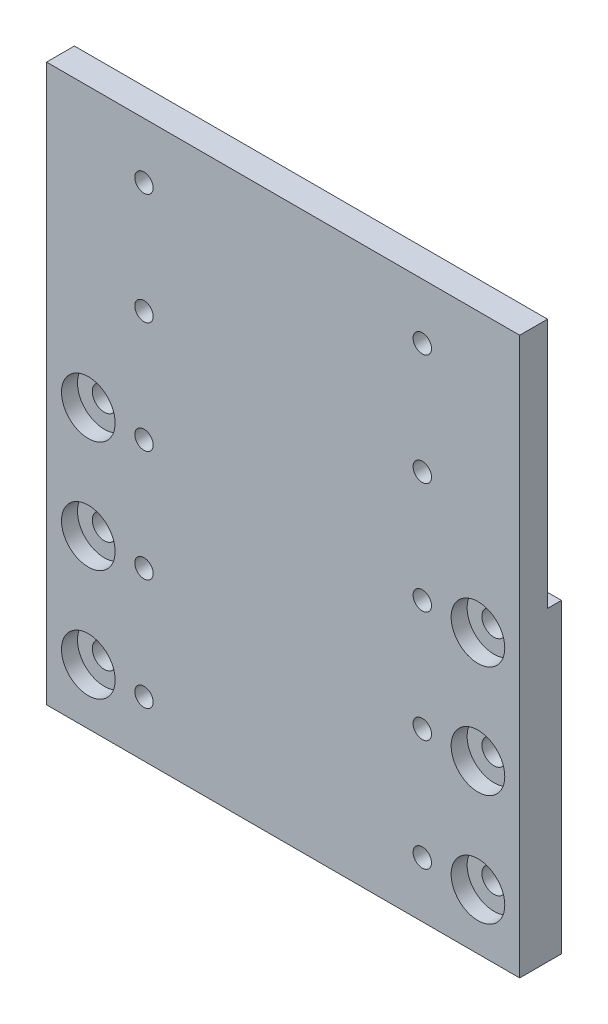
ISO-10303-21;
HEADER;
FILE_DESCRIPTION(('STEP AP214'),'2;1');
FILE_NAME('part.step','',(''),(''),'','','');
FILE_SCHEMA(('AUTOMOTIVE_DESIGN { 1 0 10303 214 1 1 1 1 }'));
ENDSEC;
DATA;
#1=APPLICATION_CONTEXT('core data for automotive mechanical design processes');
#2=APPLICATION_PROTOCOL_DEFINITION('international standard','automotive_design',2000,#1);
#3=PRODUCT_CONTEXT('',#1,'mechanical');
#4=PRODUCT('Part','Part','',(#3));
#5=PRODUCT_RELATED_PRODUCT_CATEGORY('part','',(#4));
#6=PRODUCT_DEFINITION_FORMATION('','',#4);
#7=PRODUCT_DEFINITION_CONTEXT('part definition',#1,'design');
#8=PRODUCT_DEFINITION('design','',#6,#7);
#9=PRODUCT_DEFINITION_SHAPE('','',#8);
#10=(LENGTH_UNIT() NAMED_UNIT(*) SI_UNIT(.MILLI.,.METRE.));
#11=(NAMED_UNIT(*) PLANE_ANGLE_UNIT() SI_UNIT($,.RADIAN.));
#12=(NAMED_UNIT(*) SI_UNIT($,.STERADIAN.) SOLID_ANGLE_UNIT());
#13=UNCERTAINTY_MEASURE_WITH_UNIT(LENGTH_MEASURE(1.E-05),#10,'distance_accuracy_value','');
#14=(GEOMETRIC_REPRESENTATION_CONTEXT(3) GLOBAL_UNCERTAINTY_ASSIGNED_CONTEXT((#13)) GLOBAL_UNIT_ASSIGNED_CONTEXT((#10,
#11,#12)) REPRESENTATION_CONTEXT('',''));
#15=CARTESIAN_POINT('',(0.,0.,0.));
#16=DIRECTION('',(0.,0.,1.));
#17=DIRECTION('',(1.,0.,0.));
#18=AXIS2_PLACEMENT_3D('',#15,#16,#17);
#19=CARTESIAN_POINT('',(53.975,63.5,9.525));
#20=DIRECTION('',(0.,-1.,0.));
#21=DIRECTION('',(0.,0.,-1.));
#22=AXIS2_PLACEMENT_3D('',#19,#20,#21);
#23=PLANE('',#22);
#24=DIRECTION('',(1.,0.,0.));
#25=VECTOR('',#24,1.);
#26=CARTESIAN_POINT('',(53.975,63.5,3.175));
#27=LINE('',#26,#25);
#28=CARTESIAN_POINT('',(-53.975,63.5,3.175));
#29=VERTEX_POINT('',#28);
#30=CARTESIAN_POINT('',(53.975,63.5,3.175));
#31=VERTEX_POINT('',#30);
#32=EDGE_CURVE('E104',#29,#31,#27,.T.);
#33=ORIENTED_EDGE('',*,*,#32,.F.);
#34=DIRECTION('',(0.,0.,-1.));
#35=VECTOR('',#34,1.);
#36=CARTESIAN_POINT('',(-53.975,63.5,9.525));
#37=LINE('',#36,#35);
#38=CARTESIAN_POINT('',(-53.975,63.5,9.525));
#39=VERTEX_POINT('',#38);
#40=EDGE_CURVE('E255',#39,#29,#37,.T.);
#41=ORIENTED_EDGE('',*,*,#40,.F.);
#42=DIRECTION('',(-1.,0.,0.));
#43=VECTOR('',#42,1.);
#44=CARTESIAN_POINT('',(53.975,63.5,9.525));
#45=LINE('',#44,#43);
#46=CARTESIAN_POINT('',(53.975,63.5,9.525));
#47=VERTEX_POINT('',#46);
#48=EDGE_CURVE('E56',#47,#39,#45,.T.);
#49=ORIENTED_EDGE('',*,*,#48,.F.);
#50=DIRECTION('',(0.,0.,-1.));
#51=VECTOR('',#50,1.);
#52=CARTESIAN_POINT('',(53.975,63.5,9.525));
#53=LINE('',#52,#51);
#54=EDGE_CURVE('E261',#47,#31,#53,.T.);
#55=ORIENTED_EDGE('',*,*,#54,.T.);
#56=EDGE_LOOP('',(#33,#41,#49,#55));
#57=FACE_BOUND('',#56,.T.);
#58=ADVANCED_FACE('F31',(#57),#23,.F.);
#59=CARTESIAN_POINT('',(-31.75,25.4,9.525));
#60=DIRECTION('',(0.,0.,1.));
#61=DIRECTION('',(1.,0.,0.));
#62=AXIS2_PLACEMENT_3D('',#59,#60,#61);
#63=CYLINDRICAL_SURFACE('',#62,2.1);
#64=CARTESIAN_POINT('',(-31.75,25.4,9.525));
#65=DIRECTION('',(0.,0.,1.));
#66=DIRECTION('',(1.,0.,0.));
#67=AXIS2_PLACEMENT_3D('',#64,#65,#66);
#68=CIRCLE('',#67,2.1);
#69=CARTESIAN_POINT('',(-29.65,25.4,9.525));
#70=VERTEX_POINT('',#69);
#71=EDGE_CURVE('E155',#70,#70,#68,.T.);
#72=ORIENTED_EDGE('',*,*,#71,.T.);
#73=EDGE_LOOP('',(#72));
#74=FACE_BOUND('',#73,.T.);
#75=CARTESIAN_POINT('',(-31.75,25.4,3.175));
#76=DIRECTION('',(0.,0.,-1.));
#77=DIRECTION('',(-1.,0.,0.));
#78=AXIS2_PLACEMENT_3D('',#75,#76,#77);
#79=CIRCLE('',#78,2.1);
#80=CARTESIAN_POINT('',(-33.85,25.4,3.175));
#81=VERTEX_POINT('',#80);
#82=EDGE_CURVE('E125',#81,#81,#79,.F.);
#83=ORIENTED_EDGE('',*,*,#82,.F.);
#84=EDGE_LOOP('',(#83));
#85=FACE_BOUND('',#84,.T.);
#86=ADVANCED_FACE('F291',(#74,#85),#63,.F.);
#87=CARTESIAN_POINT('',(-31.75,50.8,9.525));
#88=DIRECTION('',(0.,0.,1.));
#89=DIRECTION('',(1.,0.,0.));
#90=AXIS2_PLACEMENT_3D('',#87,#88,#89);
#91=CYLINDRICAL_SURFACE('',#90,2.1);
#92=CARTESIAN_POINT('',(-31.75,50.8,9.525));
#93=DIRECTION('',(0.,0.,1.));
#94=DIRECTION('',(1.,0.,0.));
#95=AXIS2_PLACEMENT_3D('',#92,#93,#94);
#96=CIRCLE('',#95,2.1);
#97=CARTESIAN_POINT('',(-29.65,50.8,9.525));
#98=VERTEX_POINT('',#97);
#99=EDGE_CURVE('E152',#98,#98,#96,.T.);
#100=ORIENTED_EDGE('',*,*,#99,.T.);
#101=EDGE_LOOP('',(#100));
#102=FACE_BOUND('',#101,.T.);
#103=CARTESIAN_POINT('',(-31.75,50.8,3.175));
#104=DIRECTION('',(0.,0.,-1.));
#105=DIRECTION('',(-1.,0.,0.));
#106=AXIS2_PLACEMENT_3D('',#103,#104,#105);
#107=CIRCLE('',#106,2.1);
#108=CARTESIAN_POINT('',(-33.85,50.8,3.175));
#109=VERTEX_POINT('',#108);
#110=EDGE_CURVE('E122',#109,#109,#107,.F.);
#111=ORIENTED_EDGE('',*,*,#110,.F.);
#112=EDGE_LOOP('',(#111));
#113=FACE_BOUND('',#112,.T.);
#114=ADVANCED_FACE('F297',(#102,#113),#91,.F.);
#115=CARTESIAN_POINT('',(31.75,25.4,9.525));
#116=DIRECTION('',(0.,0.,1.));
#117=DIRECTION('',(1.,0.,0.));
#118=AXIS2_PLACEMENT_3D('',#115,#116,#117);
#119=CYLINDRICAL_SURFACE('',#118,2.1);
#120=CARTESIAN_POINT('',(31.75,25.4,9.525));
#121=DIRECTION('',(0.,0.,1.));
#122=DIRECTION('',(1.,0.,0.));
#123=AXIS2_PLACEMENT_3D('',#120,#121,#122);
#124=CIRCLE('',#123,2.1);
#125=CARTESIAN_POINT('',(33.85,25.4,9.525));
#126=VERTEX_POINT('',#125);
#127=EDGE_CURVE('E131',#126,#126,#124,.T.);
#128=ORIENTED_EDGE('',*,*,#127,.T.);
#129=EDGE_LOOP('',(#128));
#130=FACE_BOUND('',#129,.T.);
#131=CARTESIAN_POINT('',(31.75,25.4,3.175));
#132=DIRECTION('',(0.,0.,-1.));
#133=DIRECTION('',(-1.,0.,0.));
#134=AXIS2_PLACEMENT_3D('',#131,#132,#133);
#135=CIRCLE('',#134,2.1);
#136=CARTESIAN_POINT('',(29.65,25.4,3.175));
#137=VERTEX_POINT('',#136);
#138=EDGE_CURVE('E119',#137,#137,#135,.F.);
#139=ORIENTED_EDGE('',*,*,#138,.F.);
#140=EDGE_LOOP('',(#139));
#141=FACE_BOUND('',#140,.T.);
#142=ADVANCED_FACE('F309',(#130,#141),#119,.F.);
#143=CARTESIAN_POINT('',(31.75,50.8,9.525));
#144=DIRECTION('',(0.,0.,1.));
#145=DIRECTION('',(1.,0.,0.));
#146=AXIS2_PLACEMENT_3D('',#143,#144,#145);
#147=CYLINDRICAL_SURFACE('',#146,2.1);
#148=CARTESIAN_POINT('',(31.75,50.8,9.525));
#149=DIRECTION('',(0.,0.,1.));
#150=DIRECTION('',(1.,0.,0.));
#151=AXIS2_PLACEMENT_3D('',#148,#149,#150);
#152=CIRCLE('',#151,2.1);
#153=CARTESIAN_POINT('',(33.85,50.8,9.525));
#154=VERTEX_POINT('',#153);
#155=EDGE_CURVE('E128',#154,#154,#152,.T.);
#156=ORIENTED_EDGE('',*,*,#155,.T.);
#157=EDGE_LOOP('',(#156));
#158=FACE_BOUND('',#157,.T.);
#159=CARTESIAN_POINT('',(31.75,50.8,3.175));
#160=DIRECTION('',(0.,0.,-1.));
#161=DIRECTION('',(-1.,0.,0.));
#162=AXIS2_PLACEMENT_3D('',#159,#160,#161);
#163=CIRCLE('',#162,2.1);
#164=CARTESIAN_POINT('',(29.65,50.8,3.175));
#165=VERTEX_POINT('',#164);
#166=EDGE_CURVE('E35',#165,#165,#163,.F.);
#167=ORIENTED_EDGE('',*,*,#166,.F.);
#168=EDGE_LOOP('',(#167));
#169=FACE_BOUND('',#168,.T.);
#170=ADVANCED_FACE('F306',(#158,#169),#147,.F.);
#171=CARTESIAN_POINT('',(-53.975,-63.5,9.525));
#172=DIRECTION('',(1.,0.,0.));
#173=DIRECTION('',(0.,0.,-1.));
#174=AXIS2_PLACEMENT_3D('',#171,#172,#173);
#175=PLANE('',#174);
#176=DIRECTION('',(0.,1.,0.));
#177=VECTOR('',#176,1.);
#178=CARTESIAN_POINT('',(-53.975,63.5,3.175));
#179=LINE('',#178,#177);
#180=CARTESIAN_POINT('',(-53.975,6.35,3.175));
#181=VERTEX_POINT('',#180);
#182=EDGE_CURVE('E97',#181,#29,#179,.T.);
#183=ORIENTED_EDGE('',*,*,#182,.F.);
#184=DIRECTION('',(0.,0.,-1.));
#185=VECTOR('',#184,1.);
#186=CARTESIAN_POINT('',(-53.975,6.35,3.175));
#187=LINE('',#186,#185);
#188=CARTESIAN_POINT('',(-53.975,6.35,0.));
#189=VERTEX_POINT('',#188);
#190=EDGE_CURVE('E94',#181,#189,#187,.T.);
#191=ORIENTED_EDGE('',*,*,#190,.T.);
#192=DIRECTION('',(0.,-1.,0.));
#193=VECTOR('',#192,1.);
#194=CARTESIAN_POINT('',(-53.975,-63.5,0.));
#195=LINE('',#194,#193);
#196=CARTESIAN_POINT('',(-53.975,-63.5,0.));
#197=VERTEX_POINT('',#196);
#198=EDGE_CURVE('E248',#189,#197,#195,.T.);
#199=ORIENTED_EDGE('',*,*,#198,.T.);
#200=DIRECTION('',(0.,0.,-1.));
#201=VECTOR('',#200,1.);
#202=CARTESIAN_POINT('',(-53.975,-63.5,9.525));
#203=LINE('',#202,#201);
#204=CARTESIAN_POINT('',(-53.975,-63.5,9.525));
#205=VERTEX_POINT('',#204);
#206=EDGE_CURVE('E11',#205,#197,#203,.T.);
#207=ORIENTED_EDGE('',*,*,#206,.F.);
#208=DIRECTION('',(0.,-1.,0.));
#209=VECTOR('',#208,1.);
#210=CARTESIAN_POINT('',(-53.975,-63.5,9.525));
#211=LINE('',#210,#209);
#212=EDGE_CURVE('E249',#39,#205,#211,.T.);
#213=ORIENTED_EDGE('',*,*,#212,.F.);
#214=ORIENTED_EDGE('',*,*,#40,.T.);
#215=EDGE_LOOP('',(#183,#191,#199,#207,#213,#214));
#216=FACE_BOUND('',#215,.T.);
#217=ADVANCED_FACE('F33',(#216),#175,.F.);
#218=CARTESIAN_POINT('',(53.975,-63.5,9.525));
#219=DIRECTION('',(0.,1.,0.));
#220=DIRECTION('',(0.,0.,1.));
#221=AXIS2_PLACEMENT_3D('',#218,#219,#220);
#222=PLANE('',#221);
#223=DIRECTION('',(1.,0.,0.));
#224=VECTOR('',#223,1.);
#225=CARTESIAN_POINT('',(53.975,-63.5,0.));
#226=LINE('',#225,#224);
#227=CARTESIAN_POINT('',(53.975,-63.5,0.));
#228=VERTEX_POINT('',#227);
#229=EDGE_CURVE('E71',#197,#228,#226,.T.);
#230=ORIENTED_EDGE('',*,*,#229,.T.);
#231=DIRECTION('',(0.,0.,-1.));
#232=VECTOR('',#231,1.);
#233=CARTESIAN_POINT('',(53.975,-63.5,9.525));
#234=LINE('',#233,#232);
#235=CARTESIAN_POINT('',(53.975,-63.5,9.525));
#236=VERTEX_POINT('',#235);
#237=EDGE_CURVE('E40',#236,#228,#234,.T.);
#238=ORIENTED_EDGE('',*,*,#237,.F.);
#239=DIRECTION('',(1.,0.,0.));
#240=VECTOR('',#239,1.);
#241=CARTESIAN_POINT('',(53.975,-63.5,9.525));
#242=LINE('',#241,#240);
#243=EDGE_CURVE('E76',#205,#236,#242,.T.);
#244=ORIENTED_EDGE('',*,*,#243,.F.);
#245=ORIENTED_EDGE('',*,*,#206,.T.);
#246=EDGE_LOOP('',(#230,#238,#244,#245));
#247=FACE_BOUND('',#246,.T.);
#248=ADVANCED_FACE('F285',(#247),#222,.F.);
#249=CARTESIAN_POINT('',(53.975,-63.5,9.525));
#250=DIRECTION('',(-1.,0.,0.));
#251=DIRECTION('',(0.,0.,1.));
#252=AXIS2_PLACEMENT_3D('',#249,#250,#251);
#253=PLANE('',#252);
#254=DIRECTION('',(0.,1.,0.));
#255=VECTOR('',#254,1.);
#256=CARTESIAN_POINT('',(53.975,-63.5,0.));
#257=LINE('',#256,#255);
#258=CARTESIAN_POINT('',(53.975,6.34999999999999,0.));
#259=VERTEX_POINT('',#258);
#260=EDGE_CURVE('E113',#228,#259,#257,.T.);
#261=ORIENTED_EDGE('',*,*,#260,.T.);
#262=DIRECTION('',(0.,0.,-1.));
#263=VECTOR('',#262,1.);
#264=CARTESIAN_POINT('',(53.975,6.35,3.175));
#265=LINE('',#264,#263);
#266=CARTESIAN_POINT('',(53.975,6.35,3.175));
#267=VERTEX_POINT('',#266);
#268=EDGE_CURVE('E47',#267,#259,#265,.T.);
#269=ORIENTED_EDGE('',*,*,#268,.F.);
#270=DIRECTION('',(0.,-1.,0.));
#271=VECTOR('',#270,1.);
#272=CARTESIAN_POINT('',(53.975,63.5,3.175));
#273=LINE('',#272,#271);
#274=EDGE_CURVE('E98',#31,#267,#273,.T.);
#275=ORIENTED_EDGE('',*,*,#274,.F.);
#276=ORIENTED_EDGE('',*,*,#54,.F.);
#277=DIRECTION('',(0.,1.,0.));
#278=VECTOR('',#277,1.);
#279=CARTESIAN_POINT('',(53.975,-63.5,9.525));
#280=LINE('',#279,#278);
#281=EDGE_CURVE('E252',#236,#47,#280,.T.);
#282=ORIENTED_EDGE('',*,*,#281,.F.);
#283=ORIENTED_EDGE('',*,*,#237,.T.);
#284=EDGE_LOOP('',(#261,#269,#275,#276,#282,#283));
#285=FACE_BOUND('',#284,.T.);
#286=ADVANCED_FACE('F111',(#285),#253,.F.);
#287=CARTESIAN_POINT('',(-53.975,63.5,9.525));
#288=DIRECTION('',(0.,0.,1.));
#289=DIRECTION('',(1.,0.,0.));
#290=AXIS2_PLACEMENT_3D('',#287,#288,#289);
#291=PLANE('',#290);
#292=ORIENTED_EDGE('',*,*,#155,.F.);
#293=EDGE_LOOP('',(#292));
#294=FACE_BOUND('',#293,.T.);
#295=ORIENTED_EDGE('',*,*,#127,.F.);
#296=EDGE_LOOP('',(#295));
#297=FACE_BOUND('',#296,.T.);
#298=CARTESIAN_POINT('',(31.75,0.,9.525));
#299=DIRECTION('',(0.,0.,1.));
#300=DIRECTION('',(1.,0.,0.));
#301=AXIS2_PLACEMENT_3D('',#298,#299,#300);
#302=CIRCLE('',#301,2.1);
#303=CARTESIAN_POINT('',(33.85,0.,9.525));
#304=VERTEX_POINT('',#303);
#305=EDGE_CURVE('E134',#304,#304,#302,.T.);
#306=ORIENTED_EDGE('',*,*,#305,.F.);
#307=EDGE_LOOP('',(#306));
#308=FACE_BOUND('',#307,.T.);
#309=CARTESIAN_POINT('',(31.75,-25.4,9.525));
#310=DIRECTION('',(0.,0.,1.));
#311=DIRECTION('',(1.,0.,0.));
#312=AXIS2_PLACEMENT_3D('',#309,#310,#311);
#313=CIRCLE('',#312,2.1);
#314=CARTESIAN_POINT('',(33.85,-25.4,9.525));
#315=VERTEX_POINT('',#314);
#316=EDGE_CURVE('E140',#315,#315,#313,.T.);
#317=ORIENTED_EDGE('',*,*,#316,.F.);
#318=EDGE_LOOP('',(#317));
#319=FACE_BOUND('',#318,.T.);
#320=CARTESIAN_POINT('',(31.75,-50.8,9.525));
#321=DIRECTION('',(0.,0.,1.));
#322=DIRECTION('',(1.,0.,0.));
#323=AXIS2_PLACEMENT_3D('',#320,#321,#322);
#324=CIRCLE('',#323,2.1);
#325=CARTESIAN_POINT('',(33.85,-50.8,9.525));
#326=VERTEX_POINT('',#325);
#327=EDGE_CURVE('E146',#326,#326,#324,.T.);
#328=ORIENTED_EDGE('',*,*,#327,.F.);
#329=EDGE_LOOP('',(#328));
#330=FACE_BOUND('',#329,.T.);
#331=ORIENTED_EDGE('',*,*,#99,.F.);
#332=EDGE_LOOP('',(#331));
#333=FACE_BOUND('',#332,.T.);
#334=ORIENTED_EDGE('',*,*,#71,.F.);
#335=EDGE_LOOP('',(#334));
#336=FACE_BOUND('',#335,.T.);
#337=CARTESIAN_POINT('',(-31.75,0.,9.525));
#338=DIRECTION('',(0.,0.,1.));
#339=DIRECTION('',(1.,0.,0.));
#340=AXIS2_PLACEMENT_3D('',#337,#338,#339);
#341=CIRCLE('',#340,2.1);
#342=CARTESIAN_POINT('',(-29.65,0.,9.525));
#343=VERTEX_POINT('',#342);
#344=EDGE_CURVE('E158',#343,#343,#341,.T.);
#345=ORIENTED_EDGE('',*,*,#344,.F.);
#346=EDGE_LOOP('',(#345));
#347=FACE_BOUND('',#346,.T.);
#348=CARTESIAN_POINT('',(-31.75,-25.4,9.525));
#349=DIRECTION('',(0.,0.,1.));
#350=DIRECTION('',(1.,0.,0.));
#351=AXIS2_PLACEMENT_3D('',#348,#349,#350);
#352=CIRCLE('',#351,2.1);
#353=CARTESIAN_POINT('',(-29.65,-25.4,9.525));
#354=VERTEX_POINT('',#353);
#355=EDGE_CURVE('E164',#354,#354,#352,.T.);
#356=ORIENTED_EDGE('',*,*,#355,.F.);
#357=EDGE_LOOP('',(#356));
#358=FACE_BOUND('',#357,.T.);
#359=CARTESIAN_POINT('',(-31.75,-50.8,9.525));
#360=DIRECTION('',(0.,0.,1.));
#361=DIRECTION('',(1.,0.,0.));
#362=AXIS2_PLACEMENT_3D('',#359,#360,#361);
#363=CIRCLE('',#362,2.1);
#364=CARTESIAN_POINT('',(-29.65,-50.8,9.525));
#365=VERTEX_POINT('',#364);
#366=EDGE_CURVE('E170',#365,#365,#363,.T.);
#367=ORIENTED_EDGE('',*,*,#366,.F.);
#368=EDGE_LOOP('',(#367));
#369=FACE_BOUND('',#368,.T.);
#370=CARTESIAN_POINT('',(44.45,0.,9.525));
#371=DIRECTION('',(0.,0.,1.));
#372=DIRECTION('',(1.,0.,0.));
#373=AXIS2_PLACEMENT_3D('',#370,#371,#372);
#374=CIRCLE('',#373,6.12);
#375=CARTESIAN_POINT('',(50.57,0.,9.525));
#376=VERTEX_POINT('',#375);
#377=EDGE_CURVE('E176',#376,#376,#374,.T.);
#378=ORIENTED_EDGE('',*,*,#377,.F.);
#379=EDGE_LOOP('',(#378));
#380=FACE_BOUND('',#379,.T.);
#381=CARTESIAN_POINT('',(44.45,-25.4,9.525));
#382=DIRECTION('',(0.,0.,1.));
#383=DIRECTION('',(1.,0.,0.));
#384=AXIS2_PLACEMENT_3D('',#381,#382,#383);
#385=CIRCLE('',#384,6.12);
#386=CARTESIAN_POINT('',(50.57,-25.4,9.525));
#387=VERTEX_POINT('',#386);
#388=EDGE_CURVE('E188',#387,#387,#385,.T.);
#389=ORIENTED_EDGE('',*,*,#388,.F.);
#390=EDGE_LOOP('',(#389));
#391=FACE_BOUND('',#390,.T.);
#392=CARTESIAN_POINT('',(44.45,-50.8,9.525));
#393=DIRECTION('',(0.,0.,1.));
#394=DIRECTION('',(1.,0.,0.));
#395=AXIS2_PLACEMENT_3D('',#392,#393,#394);
#396=CIRCLE('',#395,6.12);
#397=CARTESIAN_POINT('',(50.57,-50.8,9.525));
#398=VERTEX_POINT('',#397);
#399=EDGE_CURVE('E200',#398,#398,#396,.T.);
#400=ORIENTED_EDGE('',*,*,#399,.F.);
#401=EDGE_LOOP('',(#400));
#402=FACE_BOUND('',#401,.T.);
#403=CARTESIAN_POINT('',(-44.45,0.,9.525));
#404=DIRECTION('',(0.,0.,1.));
#405=DIRECTION('',(1.,0.,0.));
#406=AXIS2_PLACEMENT_3D('',#403,#404,#405);
#407=CIRCLE('',#406,6.12);
#408=CARTESIAN_POINT('',(-38.33,0.,9.525));
#409=VERTEX_POINT('',#408);
#410=EDGE_CURVE('E212',#409,#409,#407,.T.);
#411=ORIENTED_EDGE('',*,*,#410,.F.);
#412=EDGE_LOOP('',(#411));
#413=FACE_BOUND('',#412,.T.);
#414=CARTESIAN_POINT('',(-44.45,-25.4,9.525));
#415=DIRECTION('',(0.,0.,1.));
#416=DIRECTION('',(1.,0.,0.));
#417=AXIS2_PLACEMENT_3D('',#414,#415,#416);
#418=CIRCLE('',#417,6.12);
#419=CARTESIAN_POINT('',(-38.33,-25.4,9.525));
#420=VERTEX_POINT('',#419);
#421=EDGE_CURVE('E224',#420,#420,#418,.T.);
#422=ORIENTED_EDGE('',*,*,#421,.F.);
#423=EDGE_LOOP('',(#422));
#424=FACE_BOUND('',#423,.T.);
#425=CARTESIAN_POINT('',(-44.45,-50.8,9.525));
#426=DIRECTION('',(0.,0.,1.));
#427=DIRECTION('',(1.,0.,0.));
#428=AXIS2_PLACEMENT_3D('',#425,#426,#427);
#429=CIRCLE('',#428,6.12);
#430=CARTESIAN_POINT('',(-38.33,-50.8,9.525));
#431=VERTEX_POINT('',#430);
#432=EDGE_CURVE('E236',#431,#431,#429,.T.);
#433=ORIENTED_EDGE('',*,*,#432,.F.);
#434=EDGE_LOOP('',(#433));
#435=FACE_BOUND('',#434,.T.);
#436=ORIENTED_EDGE('',*,*,#212,.T.);
#437=ORIENTED_EDGE('',*,*,#243,.T.);
#438=ORIENTED_EDGE('',*,*,#281,.T.);
#439=ORIENTED_EDGE('',*,*,#48,.T.);
#440=EDGE_LOOP('',(#436,#437,#438,#439));
#441=FACE_BOUND('',#440,.T.);
#442=ADVANCED_FACE('F272',(#294,#297,#308,#319,#330,#333,#336,#347,#358,#369,#380,#391,#402,
#413,#424,#435,#441),#291,.T.);
#443=CARTESIAN_POINT('',(-53.975,63.5,0.));
#444=DIRECTION('',(0.,0.,1.));
#445=DIRECTION('',(1.,0.,0.));
#446=AXIS2_PLACEMENT_3D('',#443,#444,#445);
#447=PLANE('',#446);
#448=CARTESIAN_POINT('',(31.75,0.,0.));
#449=DIRECTION('',(0.,0.,1.));
#450=DIRECTION('',(1.,0.,0.));
#451=AXIS2_PLACEMENT_3D('',#448,#449,#450);
#452=CIRCLE('',#451,2.1);
#453=CARTESIAN_POINT('',(33.85,0.,0.));
#454=VERTEX_POINT('',#453);
#455=EDGE_CURVE('E137',#454,#454,#452,.T.);
#456=ORIENTED_EDGE('',*,*,#455,.T.);
#457=EDGE_LOOP('',(#456));
#458=FACE_BOUND('',#457,.T.);
#459=CARTESIAN_POINT('',(31.75,-25.4,0.));
#460=DIRECTION('',(0.,0.,1.));
#461=DIRECTION('',(1.,0.,0.));
#462=AXIS2_PLACEMENT_3D('',#459,#460,#461);
#463=CIRCLE('',#462,2.1);
#464=CARTESIAN_POINT('',(33.85,-25.4,0.));
#465=VERTEX_POINT('',#464);
#466=EDGE_CURVE('E143',#465,#465,#463,.T.);
#467=ORIENTED_EDGE('',*,*,#466,.T.);
#468=EDGE_LOOP('',(#467));
#469=FACE_BOUND('',#468,.T.);
#470=CARTESIAN_POINT('',(31.75,-50.8,0.));
#471=DIRECTION('',(0.,0.,1.));
#472=DIRECTION('',(1.,0.,0.));
#473=AXIS2_PLACEMENT_3D('',#470,#471,#472);
#474=CIRCLE('',#473,2.1);
#475=CARTESIAN_POINT('',(33.85,-50.8,0.));
#476=VERTEX_POINT('',#475);
#477=EDGE_CURVE('E149',#476,#476,#474,.T.);
#478=ORIENTED_EDGE('',*,*,#477,.T.);
#479=EDGE_LOOP('',(#478));
#480=FACE_BOUND('',#479,.T.);
#481=CARTESIAN_POINT('',(-31.75,0.,0.));
#482=DIRECTION('',(0.,0.,1.));
#483=DIRECTION('',(1.,0.,0.));
#484=AXIS2_PLACEMENT_3D('',#481,#482,#483);
#485=CIRCLE('',#484,2.1);
#486=CARTESIAN_POINT('',(-29.65,0.,0.));
#487=VERTEX_POINT('',#486);
#488=EDGE_CURVE('E161',#487,#487,#485,.T.);
#489=ORIENTED_EDGE('',*,*,#488,.T.);
#490=EDGE_LOOP('',(#489));
#491=FACE_BOUND('',#490,.T.);
#492=CARTESIAN_POINT('',(-31.75,-25.4,0.));
#493=DIRECTION('',(0.,0.,1.));
#494=DIRECTION('',(1.,0.,0.));
#495=AXIS2_PLACEMENT_3D('',#492,#493,#494);
#496=CIRCLE('',#495,2.1);
#497=CARTESIAN_POINT('',(-29.65,-25.4,0.));
#498=VERTEX_POINT('',#497);
#499=EDGE_CURVE('E167',#498,#498,#496,.T.);
#500=ORIENTED_EDGE('',*,*,#499,.T.);
#501=EDGE_LOOP('',(#500));
#502=FACE_BOUND('',#501,.T.);
#503=CARTESIAN_POINT('',(-31.75,-50.8,0.));
#504=DIRECTION('',(0.,0.,1.));
#505=DIRECTION('',(1.,0.,0.));
#506=AXIS2_PLACEMENT_3D('',#503,#504,#505);
#507=CIRCLE('',#506,2.1);
#508=CARTESIAN_POINT('',(-29.65,-50.8,0.));
#509=VERTEX_POINT('',#508);
#510=EDGE_CURVE('E173',#509,#509,#507,.T.);
#511=ORIENTED_EDGE('',*,*,#510,.T.);
#512=EDGE_LOOP('',(#511));
#513=FACE_BOUND('',#512,.T.);
#514=CARTESIAN_POINT('',(44.45,0.,0.));
#515=DIRECTION('',(0.,0.,1.));
#516=DIRECTION('',(1.,0.,0.));
#517=AXIS2_PLACEMENT_3D('',#514,#515,#516);
#518=CIRCLE('',#517,2.75);
#519=CARTESIAN_POINT('',(47.2,0.,0.));
#520=VERTEX_POINT('',#519);
#521=EDGE_CURVE('E185',#520,#520,#518,.T.);
#522=ORIENTED_EDGE('',*,*,#521,.T.);
#523=EDGE_LOOP('',(#522));
#524=FACE_BOUND('',#523,.T.);
#525=CARTESIAN_POINT('',(44.45,-25.4,0.));
#526=DIRECTION('',(0.,0.,1.));
#527=DIRECTION('',(1.,0.,0.));
#528=AXIS2_PLACEMENT_3D('',#525,#526,#527);
#529=CIRCLE('',#528,2.75);
#530=CARTESIAN_POINT('',(47.2,-25.4,0.));
#531=VERTEX_POINT('',#530);
#532=EDGE_CURVE('E197',#531,#531,#529,.T.);
#533=ORIENTED_EDGE('',*,*,#532,.T.);
#534=EDGE_LOOP('',(#533));
#535=FACE_BOUND('',#534,.T.);
#536=CARTESIAN_POINT('',(44.45,-50.8,0.));
#537=DIRECTION('',(0.,0.,1.));
#538=DIRECTION('',(1.,0.,0.));
#539=AXIS2_PLACEMENT_3D('',#536,#537,#538);
#540=CIRCLE('',#539,2.75);
#541=CARTESIAN_POINT('',(47.2,-50.8,0.));
#542=VERTEX_POINT('',#541);
#543=EDGE_CURVE('E209',#542,#542,#540,.T.);
#544=ORIENTED_EDGE('',*,*,#543,.T.);
#545=EDGE_LOOP('',(#544));
#546=FACE_BOUND('',#545,.T.);
#547=CARTESIAN_POINT('',(-44.45,0.,0.));
#548=DIRECTION('',(0.,0.,1.));
#549=DIRECTION('',(1.,0.,0.));
#550=AXIS2_PLACEMENT_3D('',#547,#548,#549);
#551=CIRCLE('',#550,2.75);
#552=CARTESIAN_POINT('',(-41.7,0.,0.));
#553=VERTEX_POINT('',#552);
#554=EDGE_CURVE('E221',#553,#553,#551,.T.);
#555=ORIENTED_EDGE('',*,*,#554,.T.);
#556=EDGE_LOOP('',(#555));
#557=FACE_BOUND('',#556,.T.);
#558=CARTESIAN_POINT('',(-44.45,-25.4,0.));
#559=DIRECTION('',(0.,0.,1.));
#560=DIRECTION('',(1.,0.,0.));
#561=AXIS2_PLACEMENT_3D('',#558,#559,#560);
#562=CIRCLE('',#561,2.75);
#563=CARTESIAN_POINT('',(-41.7,-25.4,0.));
#564=VERTEX_POINT('',#563);
#565=EDGE_CURVE('E233',#564,#564,#562,.T.);
#566=ORIENTED_EDGE('',*,*,#565,.T.);
#567=EDGE_LOOP('',(#566));
#568=FACE_BOUND('',#567,.T.);
#569=CARTESIAN_POINT('',(-44.45,-50.8,0.));
#570=DIRECTION('',(0.,0.,1.));
#571=DIRECTION('',(1.,0.,0.));
#572=AXIS2_PLACEMENT_3D('',#569,#570,#571);
#573=CIRCLE('',#572,2.75);
#574=CARTESIAN_POINT('',(-41.7,-50.8,0.));
#575=VERTEX_POINT('',#574);
#576=EDGE_CURVE('E245',#575,#575,#573,.T.);
#577=ORIENTED_EDGE('',*,*,#576,.T.);
#578=EDGE_LOOP('',(#577));
#579=FACE_BOUND('',#578,.T.);
#580=ORIENTED_EDGE('',*,*,#198,.F.);
#581=DIRECTION('',(-1.,0.,0.));
#582=VECTOR('',#581,1.);
#583=CARTESIAN_POINT('',(53.975,6.35,0.));
#584=LINE('',#583,#582);
#585=EDGE_CURVE('E108',#259,#189,#584,.T.);
#586=ORIENTED_EDGE('',*,*,#585,.F.);
#587=ORIENTED_EDGE('',*,*,#260,.F.);
#588=ORIENTED_EDGE('',*,*,#229,.F.);
#589=EDGE_LOOP('',(#580,#586,#587,#588));
#590=FACE_BOUND('',#589,.T.);
#591=ADVANCED_FACE('F266',(#458,#469,#480,#491,#502,#513,#524,#535,#546,#557,#568,#579,#590),
#447,.F.);
#592=CARTESIAN_POINT('',(-44.45,-50.8,9.525));
#593=DIRECTION('',(0.,0.,1.));
#594=DIRECTION('',(1.,0.,0.));
#595=AXIS2_PLACEMENT_3D('',#592,#593,#594);
#596=CYLINDRICAL_SURFACE('',#595,2.75);
#597=ORIENTED_EDGE('',*,*,#576,.F.);
#598=EDGE_LOOP('',(#597));
#599=FACE_BOUND('',#598,.T.);
#600=CARTESIAN_POINT('',(-44.45,-50.8,5.875));
#601=DIRECTION('',(0.,0.,1.));
#602=DIRECTION('',(1.,0.,0.));
#603=AXIS2_PLACEMENT_3D('',#600,#601,#602);
#604=CIRCLE('',#603,2.75000000000001);
#605=CARTESIAN_POINT('',(-41.7,-50.8,5.875));
#606=VERTEX_POINT('',#605);
#607=EDGE_CURVE('E242',#606,#606,#604,.T.);
#608=ORIENTED_EDGE('',*,*,#607,.T.);
#609=EDGE_LOOP('',(#608));
#610=FACE_BOUND('',#609,.T.);
#611=ADVANCED_FACE('F281',(#599,#610),#596,.F.);
#612=CARTESIAN_POINT('',(-41.7,-50.8,5.875));
#613=DIRECTION('',(0.,0.,-1.));
#614=DIRECTION('',(-1.,0.,0.));
#615=AXIS2_PLACEMENT_3D('',#612,#613,#614);
#616=PLANE('',#615);
#617=ORIENTED_EDGE('',*,*,#607,.F.);
#618=EDGE_LOOP('',(#617));
#619=FACE_BOUND('',#618,.T.);
#620=CARTESIAN_POINT('',(-44.45,-50.8,5.875));
#621=DIRECTION('',(0.,0.,1.));
#622=DIRECTION('',(1.,0.,0.));
#623=AXIS2_PLACEMENT_3D('',#620,#621,#622);
#624=CIRCLE('',#623,6.11999999999999);
#625=CARTESIAN_POINT('',(-38.33,-50.8,5.875));
#626=VERTEX_POINT('',#625);
#627=EDGE_CURVE('E239',#626,#626,#624,.T.);
#628=ORIENTED_EDGE('',*,*,#627,.T.);
#629=EDGE_LOOP('',(#628));
#630=FACE_BOUND('',#629,.T.);
#631=ADVANCED_FACE('F411',(#619,#630),#616,.F.);
#632=CARTESIAN_POINT('',(-44.45,-50.8,9.525));
#633=DIRECTION('',(0.,0.,1.));
#634=DIRECTION('',(1.,0.,0.));
#635=AXIS2_PLACEMENT_3D('',#632,#633,#634);
#636=CYLINDRICAL_SURFACE('',#635,6.12);
#637=ORIENTED_EDGE('',*,*,#627,.F.);
#638=EDGE_LOOP('',(#637));
#639=FACE_BOUND('',#638,.T.);
#640=ORIENTED_EDGE('',*,*,#432,.T.);
#641=EDGE_LOOP('',(#640));
#642=FACE_BOUND('',#641,.T.);
#643=ADVANCED_FACE('F407',(#639,#642),#636,.F.);
#644=CARTESIAN_POINT('',(-44.45,-25.4,9.525));
#645=DIRECTION('',(0.,0.,1.));
#646=DIRECTION('',(1.,0.,0.));
#647=AXIS2_PLACEMENT_3D('',#644,#645,#646);
#648=CYLINDRICAL_SURFACE('',#647,2.75);
#649=ORIENTED_EDGE('',*,*,#565,.F.);
#650=EDGE_LOOP('',(#649));
#651=FACE_BOUND('',#650,.T.);
#652=CARTESIAN_POINT('',(-44.45,-25.4,5.875));
#653=DIRECTION('',(0.,0.,1.));
#654=DIRECTION('',(1.,0.,0.));
#655=AXIS2_PLACEMENT_3D('',#652,#653,#654);
#656=CIRCLE('',#655,2.75000000000001);
#657=CARTESIAN_POINT('',(-41.7,-25.4,5.875));
#658=VERTEX_POINT('',#657);
#659=EDGE_CURVE('E230',#658,#658,#656,.T.);
#660=ORIENTED_EDGE('',*,*,#659,.T.);
#661=EDGE_LOOP('',(#660));
#662=FACE_BOUND('',#661,.T.);
#663=ADVANCED_FACE('F403',(#651,#662),#648,.F.);
#664=CARTESIAN_POINT('',(-41.7,-25.4,5.875));
#665=DIRECTION('',(0.,0.,-1.));
#666=DIRECTION('',(-1.,0.,0.));
#667=AXIS2_PLACEMENT_3D('',#664,#665,#666);
#668=PLANE('',#667);
#669=ORIENTED_EDGE('',*,*,#659,.F.);
#670=EDGE_LOOP('',(#669));
#671=FACE_BOUND('',#670,.T.);
#672=CARTESIAN_POINT('',(-44.45,-25.4,5.875));
#673=DIRECTION('',(0.,0.,1.));
#674=DIRECTION('',(1.,0.,0.));
#675=AXIS2_PLACEMENT_3D('',#672,#673,#674);
#676=CIRCLE('',#675,6.11999999999999);
#677=CARTESIAN_POINT('',(-38.33,-25.4,5.875));
#678=VERTEX_POINT('',#677);
#679=EDGE_CURVE('E227',#678,#678,#676,.T.);
#680=ORIENTED_EDGE('',*,*,#679,.T.);
#681=EDGE_LOOP('',(#680));
#682=FACE_BOUND('',#681,.T.);
#683=ADVANCED_FACE('F399',(#671,#682),#668,.F.);
#684=CARTESIAN_POINT('',(-44.45,-25.4,9.525));
#685=DIRECTION('',(0.,0.,1.));
#686=DIRECTION('',(1.,0.,0.));
#687=AXIS2_PLACEMENT_3D('',#684,#685,#686);
#688=CYLINDRICAL_SURFACE('',#687,6.12);
#689=ORIENTED_EDGE('',*,*,#679,.F.);
#690=EDGE_LOOP('',(#689));
#691=FACE_BOUND('',#690,.T.);
#692=ORIENTED_EDGE('',*,*,#421,.T.);
#693=EDGE_LOOP('',(#692));
#694=FACE_BOUND('',#693,.T.);
#695=ADVANCED_FACE('F395',(#691,#694),#688,.F.);
#696=CARTESIAN_POINT('',(-44.45,0.,9.525));
#697=DIRECTION('',(0.,0.,1.));
#698=DIRECTION('',(1.,0.,0.));
#699=AXIS2_PLACEMENT_3D('',#696,#697,#698);
#700=CYLINDRICAL_SURFACE('',#699,2.75);
#701=ORIENTED_EDGE('',*,*,#554,.F.);
#702=EDGE_LOOP('',(#701));
#703=FACE_BOUND('',#702,.T.);
#704=CARTESIAN_POINT('',(-44.45,0.,5.875));
#705=DIRECTION('',(0.,0.,1.));
#706=DIRECTION('',(1.,0.,0.));
#707=AXIS2_PLACEMENT_3D('',#704,#705,#706);
#708=CIRCLE('',#707,2.75000000000001);
#709=CARTESIAN_POINT('',(-41.7,0.,5.875));
#710=VERTEX_POINT('',#709);
#711=EDGE_CURVE('E218',#710,#710,#708,.T.);
#712=ORIENTED_EDGE('',*,*,#711,.T.);
#713=EDGE_LOOP('',(#712));
#714=FACE_BOUND('',#713,.T.);
#715=ADVANCED_FACE('F391',(#703,#714),#700,.F.);
#716=CARTESIAN_POINT('',(-41.7,0.,5.875));
#717=DIRECTION('',(0.,0.,-1.));
#718=DIRECTION('',(-1.,0.,0.));
#719=AXIS2_PLACEMENT_3D('',#716,#717,#718);
#720=PLANE('',#719);
#721=ORIENTED_EDGE('',*,*,#711,.F.);
#722=EDGE_LOOP('',(#721));
#723=FACE_BOUND('',#722,.T.);
#724=CARTESIAN_POINT('',(-44.45,0.,5.875));
#725=DIRECTION('',(0.,0.,1.));
#726=DIRECTION('',(1.,0.,0.));
#727=AXIS2_PLACEMENT_3D('',#724,#725,#726);
#728=CIRCLE('',#727,6.11999999999999);
#729=CARTESIAN_POINT('',(-38.33,0.,5.875));
#730=VERTEX_POINT('',#729);
#731=EDGE_CURVE('E215',#730,#730,#728,.T.);
#732=ORIENTED_EDGE('',*,*,#731,.T.);
#733=EDGE_LOOP('',(#732));
#734=FACE_BOUND('',#733,.T.);
#735=ADVANCED_FACE('F387',(#723,#734),#720,.F.);
#736=CARTESIAN_POINT('',(-44.45,0.,9.525));
#737=DIRECTION('',(0.,0.,1.));
#738=DIRECTION('',(1.,0.,0.));
#739=AXIS2_PLACEMENT_3D('',#736,#737,#738);
#740=CYLINDRICAL_SURFACE('',#739,6.12);
#741=ORIENTED_EDGE('',*,*,#731,.F.);
#742=EDGE_LOOP('',(#741));
#743=FACE_BOUND('',#742,.T.);
#744=ORIENTED_EDGE('',*,*,#410,.T.);
#745=EDGE_LOOP('',(#744));
#746=FACE_BOUND('',#745,.T.);
#747=ADVANCED_FACE('F383',(#743,#746),#740,.F.);
#748=CARTESIAN_POINT('',(44.45,-50.8,9.525));
#749=DIRECTION('',(0.,0.,1.));
#750=DIRECTION('',(1.,0.,0.));
#751=AXIS2_PLACEMENT_3D('',#748,#749,#750);
#752=CYLINDRICAL_SURFACE('',#751,2.75);
#753=ORIENTED_EDGE('',*,*,#543,.F.);
#754=EDGE_LOOP('',(#753));
#755=FACE_BOUND('',#754,.T.);
#756=CARTESIAN_POINT('',(44.45,-50.8,5.875));
#757=DIRECTION('',(0.,0.,1.));
#758=DIRECTION('',(1.,0.,0.));
#759=AXIS2_PLACEMENT_3D('',#756,#757,#758);
#760=CIRCLE('',#759,2.75000000000001);
#761=CARTESIAN_POINT('',(47.2,-50.8,5.875));
#762=VERTEX_POINT('',#761);
#763=EDGE_CURVE('E206',#762,#762,#760,.T.);
#764=ORIENTED_EDGE('',*,*,#763,.T.);
#765=EDGE_LOOP('',(#764));
#766=FACE_BOUND('',#765,.T.);
#767=ADVANCED_FACE('F379',(#755,#766),#752,.F.);
#768=CARTESIAN_POINT('',(47.2,-50.8,5.875));
#769=DIRECTION('',(0.,0.,-1.));
#770=DIRECTION('',(-1.,0.,0.));
#771=AXIS2_PLACEMENT_3D('',#768,#769,#770);
#772=PLANE('',#771);
#773=ORIENTED_EDGE('',*,*,#763,.F.);
#774=EDGE_LOOP('',(#773));
#775=FACE_BOUND('',#774,.T.);
#776=CARTESIAN_POINT('',(44.45,-50.8,5.875));
#777=DIRECTION('',(0.,0.,1.));
#778=DIRECTION('',(1.,0.,0.));
#779=AXIS2_PLACEMENT_3D('',#776,#777,#778);
#780=CIRCLE('',#779,6.11999999999999);
#781=CARTESIAN_POINT('',(50.57,-50.8,5.875));
#782=VERTEX_POINT('',#781);
#783=EDGE_CURVE('E203',#782,#782,#780,.T.);
#784=ORIENTED_EDGE('',*,*,#783,.T.);
#785=EDGE_LOOP('',(#784));
#786=FACE_BOUND('',#785,.T.);
#787=ADVANCED_FACE('F375',(#775,#786),#772,.F.);
#788=CARTESIAN_POINT('',(44.45,-50.8,9.525));
#789=DIRECTION('',(0.,0.,1.));
#790=DIRECTION('',(1.,0.,0.));
#791=AXIS2_PLACEMENT_3D('',#788,#789,#790);
#792=CYLINDRICAL_SURFACE('',#791,6.12);
#793=ORIENTED_EDGE('',*,*,#783,.F.);
#794=EDGE_LOOP('',(#793));
#795=FACE_BOUND('',#794,.T.);
#796=ORIENTED_EDGE('',*,*,#399,.T.);
#797=EDGE_LOOP('',(#796));
#798=FACE_BOUND('',#797,.T.);
#799=ADVANCED_FACE('F371',(#795,#798),#792,.F.);
#800=CARTESIAN_POINT('',(44.45,-25.4,9.525));
#801=DIRECTION('',(0.,0.,1.));
#802=DIRECTION('',(1.,0.,0.));
#803=AXIS2_PLACEMENT_3D('',#800,#801,#802);
#804=CYLINDRICAL_SURFACE('',#803,2.75);
#805=ORIENTED_EDGE('',*,*,#532,.F.);
#806=EDGE_LOOP('',(#805));
#807=FACE_BOUND('',#806,.T.);
#808=CARTESIAN_POINT('',(44.45,-25.4,5.875));
#809=DIRECTION('',(0.,0.,1.));
#810=DIRECTION('',(1.,0.,0.));
#811=AXIS2_PLACEMENT_3D('',#808,#809,#810);
#812=CIRCLE('',#811,2.75000000000001);
#813=CARTESIAN_POINT('',(47.2,-25.4,5.875));
#814=VERTEX_POINT('',#813);
#815=EDGE_CURVE('E194',#814,#814,#812,.T.);
#816=ORIENTED_EDGE('',*,*,#815,.T.);
#817=EDGE_LOOP('',(#816));
#818=FACE_BOUND('',#817,.T.);
#819=ADVANCED_FACE('F367',(#807,#818),#804,.F.);
#820=CARTESIAN_POINT('',(47.2,-25.4,5.875));
#821=DIRECTION('',(0.,0.,-1.));
#822=DIRECTION('',(-1.,0.,0.));
#823=AXIS2_PLACEMENT_3D('',#820,#821,#822);
#824=PLANE('',#823);
#825=ORIENTED_EDGE('',*,*,#815,.F.);
#826=EDGE_LOOP('',(#825));
#827=FACE_BOUND('',#826,.T.);
#828=CARTESIAN_POINT('',(44.45,-25.4,5.875));
#829=DIRECTION('',(0.,0.,1.));
#830=DIRECTION('',(1.,0.,0.));
#831=AXIS2_PLACEMENT_3D('',#828,#829,#830);
#832=CIRCLE('',#831,6.11999999999999);
#833=CARTESIAN_POINT('',(50.57,-25.4,5.875));
#834=VERTEX_POINT('',#833);
#835=EDGE_CURVE('E191',#834,#834,#832,.T.);
#836=ORIENTED_EDGE('',*,*,#835,.T.);
#837=EDGE_LOOP('',(#836));
#838=FACE_BOUND('',#837,.T.);
#839=ADVANCED_FACE('F363',(#827,#838),#824,.F.);
#840=CARTESIAN_POINT('',(44.45,-25.4,9.525));
#841=DIRECTION('',(0.,0.,1.));
#842=DIRECTION('',(1.,0.,0.));
#843=AXIS2_PLACEMENT_3D('',#840,#841,#842);
#844=CYLINDRICAL_SURFACE('',#843,6.12);
#845=ORIENTED_EDGE('',*,*,#835,.F.);
#846=EDGE_LOOP('',(#845));
#847=FACE_BOUND('',#846,.T.);
#848=ORIENTED_EDGE('',*,*,#388,.T.);
#849=EDGE_LOOP('',(#848));
#850=FACE_BOUND('',#849,.T.);
#851=ADVANCED_FACE('F359',(#847,#850),#844,.F.);
#852=CARTESIAN_POINT('',(44.45,0.,9.525));
#853=DIRECTION('',(0.,0.,1.));
#854=DIRECTION('',(1.,0.,0.));
#855=AXIS2_PLACEMENT_3D('',#852,#853,#854);
#856=CYLINDRICAL_SURFACE('',#855,2.75);
#857=ORIENTED_EDGE('',*,*,#521,.F.);
#858=EDGE_LOOP('',(#857));
#859=FACE_BOUND('',#858,.T.);
#860=CARTESIAN_POINT('',(44.45,0.,5.875));
#861=DIRECTION('',(0.,0.,1.));
#862=DIRECTION('',(1.,0.,0.));
#863=AXIS2_PLACEMENT_3D('',#860,#861,#862);
#864=CIRCLE('',#863,2.75000000000001);
#865=CARTESIAN_POINT('',(47.2,0.,5.875));
#866=VERTEX_POINT('',#865);
#867=EDGE_CURVE('E182',#866,#866,#864,.T.);
#868=ORIENTED_EDGE('',*,*,#867,.T.);
#869=EDGE_LOOP('',(#868));
#870=FACE_BOUND('',#869,.T.);
#871=ADVANCED_FACE('F355',(#859,#870),#856,.F.);
#872=CARTESIAN_POINT('',(47.2,0.,5.875));
#873=DIRECTION('',(0.,0.,-1.));
#874=DIRECTION('',(-1.,0.,0.));
#875=AXIS2_PLACEMENT_3D('',#872,#873,#874);
#876=PLANE('',#875);
#877=ORIENTED_EDGE('',*,*,#867,.F.);
#878=EDGE_LOOP('',(#877));
#879=FACE_BOUND('',#878,.T.);
#880=CARTESIAN_POINT('',(44.45,0.,5.875));
#881=DIRECTION('',(0.,0.,1.));
#882=DIRECTION('',(1.,0.,0.));
#883=AXIS2_PLACEMENT_3D('',#880,#881,#882);
#884=CIRCLE('',#883,6.11999999999999);
#885=CARTESIAN_POINT('',(50.57,0.,5.875));
#886=VERTEX_POINT('',#885);
#887=EDGE_CURVE('E179',#886,#886,#884,.T.);
#888=ORIENTED_EDGE('',*,*,#887,.T.);
#889=EDGE_LOOP('',(#888));
#890=FACE_BOUND('',#889,.T.);
#891=ADVANCED_FACE('F351',(#879,#890),#876,.F.);
#892=CARTESIAN_POINT('',(44.45,0.,9.525));
#893=DIRECTION('',(0.,0.,1.));
#894=DIRECTION('',(1.,0.,0.));
#895=AXIS2_PLACEMENT_3D('',#892,#893,#894);
#896=CYLINDRICAL_SURFACE('',#895,6.12);
#897=ORIENTED_EDGE('',*,*,#887,.F.);
#898=EDGE_LOOP('',(#897));
#899=FACE_BOUND('',#898,.T.);
#900=ORIENTED_EDGE('',*,*,#377,.T.);
#901=EDGE_LOOP('',(#900));
#902=FACE_BOUND('',#901,.T.);
#903=ADVANCED_FACE('F347',(#899,#902),#896,.F.);
#904=CARTESIAN_POINT('',(-31.75,-50.8,9.525));
#905=DIRECTION('',(0.,0.,1.));
#906=DIRECTION('',(1.,0.,0.));
#907=AXIS2_PLACEMENT_3D('',#904,#905,#906);
#908=CYLINDRICAL_SURFACE('',#907,2.1);
#909=ORIENTED_EDGE('',*,*,#510,.F.);
#910=EDGE_LOOP('',(#909));
#911=FACE_BOUND('',#910,.T.);
#912=ORIENTED_EDGE('',*,*,#366,.T.);
#913=EDGE_LOOP('',(#912));
#914=FACE_BOUND('',#913,.T.);
#915=ADVANCED_FACE('F343',(#911,#914),#908,.F.);
#916=CARTESIAN_POINT('',(-31.75,-25.4,9.525));
#917=DIRECTION('',(0.,0.,1.));
#918=DIRECTION('',(1.,0.,0.));
#919=AXIS2_PLACEMENT_3D('',#916,#917,#918);
#920=CYLINDRICAL_SURFACE('',#919,2.1);
#921=ORIENTED_EDGE('',*,*,#499,.F.);
#922=EDGE_LOOP('',(#921));
#923=FACE_BOUND('',#922,.T.);
#924=ORIENTED_EDGE('',*,*,#355,.T.);
#925=EDGE_LOOP('',(#924));
#926=FACE_BOUND('',#925,.T.);
#927=ADVANCED_FACE('F339',(#923,#926),#920,.F.);
#928=CARTESIAN_POINT('',(-31.75,0.,9.525));
#929=DIRECTION('',(0.,0.,1.));
#930=DIRECTION('',(1.,0.,0.));
#931=AXIS2_PLACEMENT_3D('',#928,#929,#930);
#932=CYLINDRICAL_SURFACE('',#931,2.1);
#933=ORIENTED_EDGE('',*,*,#488,.F.);
#934=EDGE_LOOP('',(#933));
#935=FACE_BOUND('',#934,.T.);
#936=ORIENTED_EDGE('',*,*,#344,.T.);
#937=EDGE_LOOP('',(#936));
#938=FACE_BOUND('',#937,.T.);
#939=ADVANCED_FACE('F332',(#935,#938),#932,.F.);
#940=CARTESIAN_POINT('',(31.75,-50.8,9.525));
#941=DIRECTION('',(0.,0.,1.));
#942=DIRECTION('',(1.,0.,0.));
#943=AXIS2_PLACEMENT_3D('',#940,#941,#942);
#944=CYLINDRICAL_SURFACE('',#943,2.1);
#945=ORIENTED_EDGE('',*,*,#477,.F.);
#946=EDGE_LOOP('',(#945));
#947=FACE_BOUND('',#946,.T.);
#948=ORIENTED_EDGE('',*,*,#327,.T.);
#949=EDGE_LOOP('',(#948));
#950=FACE_BOUND('',#949,.T.);
#951=ADVANCED_FACE('F328',(#947,#950),#944,.F.);
#952=CARTESIAN_POINT('',(31.75,-25.4,9.525));
#953=DIRECTION('',(0.,0.,1.));
#954=DIRECTION('',(1.,0.,0.));
#955=AXIS2_PLACEMENT_3D('',#952,#953,#954);
#956=CYLINDRICAL_SURFACE('',#955,2.1);
#957=ORIENTED_EDGE('',*,*,#466,.F.);
#958=EDGE_LOOP('',(#957));
#959=FACE_BOUND('',#958,.T.);
#960=ORIENTED_EDGE('',*,*,#316,.T.);
#961=EDGE_LOOP('',(#960));
#962=FACE_BOUND('',#961,.T.);
#963=ADVANCED_FACE('F324',(#959,#962),#956,.F.);
#964=CARTESIAN_POINT('',(31.75,0.,9.525));
#965=DIRECTION('',(0.,0.,1.));
#966=DIRECTION('',(1.,0.,0.));
#967=AXIS2_PLACEMENT_3D('',#964,#965,#966);
#968=CYLINDRICAL_SURFACE('',#967,2.1);
#969=ORIENTED_EDGE('',*,*,#455,.F.);
#970=EDGE_LOOP('',(#969));
#971=FACE_BOUND('',#970,.T.);
#972=ORIENTED_EDGE('',*,*,#305,.T.);
#973=EDGE_LOOP('',(#972));
#974=FACE_BOUND('',#973,.T.);
#975=ADVANCED_FACE('F321',(#971,#974),#968,.F.);
#976=CARTESIAN_POINT('',(53.975,6.35,3.175));
#977=DIRECTION('',(0.,0.,-1.));
#978=DIRECTION('',(-1.,0.,0.));
#979=AXIS2_PLACEMENT_3D('',#976,#977,#978);
#980=PLANE('',#979);
#981=ORIENTED_EDGE('',*,*,#110,.T.);
#982=EDGE_LOOP('',(#981));
#983=FACE_BOUND('',#982,.T.);
#984=ORIENTED_EDGE('',*,*,#166,.T.);
#985=EDGE_LOOP('',(#984));
#986=FACE_BOUND('',#985,.T.);
#987=ORIENTED_EDGE('',*,*,#274,.T.);
#988=DIRECTION('',(-1.,0.,0.));
#989=VECTOR('',#988,1.);
#990=CARTESIAN_POINT('',(53.975,6.35,3.175));
#991=LINE('',#990,#989);
#992=EDGE_CURVE('E90',#267,#181,#991,.T.);
#993=ORIENTED_EDGE('',*,*,#992,.T.);
#994=ORIENTED_EDGE('',*,*,#182,.T.);
#995=ORIENTED_EDGE('',*,*,#32,.T.);
#996=EDGE_LOOP('',(#987,#993,#994,#995));
#997=FACE_BOUND('',#996,.T.);
#998=ORIENTED_EDGE('',*,*,#138,.T.);
#999=EDGE_LOOP('',(#998));
#1000=FACE_BOUND('',#999,.T.);
#1001=ORIENTED_EDGE('',*,*,#82,.T.);
#1002=EDGE_LOOP('',(#1001));
#1003=FACE_BOUND('',#1002,.T.);
#1004=ADVANCED_FACE('F101',(#983,#986,#997,#1000,#1003),#980,.T.);
#1005=CARTESIAN_POINT('',(53.975,6.35,3.175));
#1006=DIRECTION('',(0.,-1.,0.));
#1007=DIRECTION('',(0.,0.,-1.));
#1008=AXIS2_PLACEMENT_3D('',#1005,#1006,#1007);
#1009=PLANE('',#1008);
#1010=ORIENTED_EDGE('',*,*,#585,.T.);
#1011=ORIENTED_EDGE('',*,*,#190,.F.);
#1012=ORIENTED_EDGE('',*,*,#992,.F.);
#1013=ORIENTED_EDGE('',*,*,#268,.T.);
#1014=EDGE_LOOP('',(#1010,#1011,#1012,#1013));
#1015=FACE_BOUND('',#1014,.T.);
#1016=ADVANCED_FACE('F92',(#1015),#1009,.F.);
#1017=CLOSED_SHELL('',(#58,#86,#114,#142,#170,#217,#248,#286,#442,#591,#611,#631,#643,#663,#683,
#695,#715,#735,#747,#767,#787,#799,#819,#839,#851,#871,#891,#903,#915,#927,#939,#951,#963,#975,
#1004,#1016));
#1018=MANIFOLD_SOLID_BREP('B2',#1017);
#1019=ADVANCED_BREP_SHAPE_REPRESENTATION('',(#18,#1018),#14);
#1020=SHAPE_DEFINITION_REPRESENTATION(#9,#1019);
ENDSEC;
END-ISO-10303-21;
